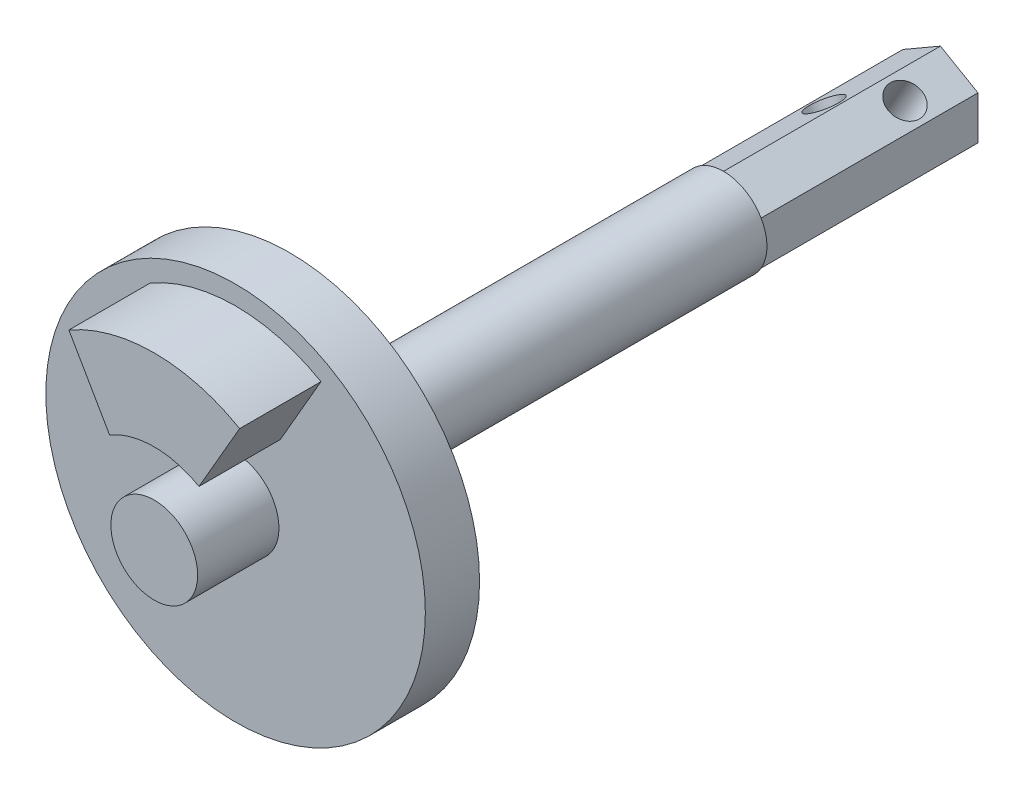
ISO-10303-21;
HEADER;
FILE_DESCRIPTION(('STEP AP214'),'2;1');
FILE_NAME('part.step','',(''),(''),'','','');
FILE_SCHEMA(('AUTOMOTIVE_DESIGN { 1 0 10303 214 1 1 1 1 }'));
ENDSEC;
DATA;
#1=APPLICATION_CONTEXT('core data for automotive mechanical design processes');
#2=APPLICATION_PROTOCOL_DEFINITION('international standard','automotive_design',2000,#1);
#3=PRODUCT_CONTEXT('',#1,'mechanical');
#4=PRODUCT('Part','Part','',(#3));
#5=PRODUCT_RELATED_PRODUCT_CATEGORY('part','',(#4));
#6=PRODUCT_DEFINITION_FORMATION('','',#4);
#7=PRODUCT_DEFINITION_CONTEXT('part definition',#1,'design');
#8=PRODUCT_DEFINITION('design','',#6,#7);
#9=PRODUCT_DEFINITION_SHAPE('','',#8);
#10=(LENGTH_UNIT() NAMED_UNIT(*) SI_UNIT(.MILLI.,.METRE.));
#11=(NAMED_UNIT(*) PLANE_ANGLE_UNIT() SI_UNIT($,.RADIAN.));
#12=(NAMED_UNIT(*) SI_UNIT($,.STERADIAN.) SOLID_ANGLE_UNIT());
#13=UNCERTAINTY_MEASURE_WITH_UNIT(LENGTH_MEASURE(1.E-05),#10,'distance_accuracy_value','');
#14=(GEOMETRIC_REPRESENTATION_CONTEXT(3) GLOBAL_UNCERTAINTY_ASSIGNED_CONTEXT((#13)) GLOBAL_UNIT_ASSIGNED_CONTEXT((#10,
#11,#12)) REPRESENTATION_CONTEXT('',''));
#15=CARTESIAN_POINT('',(0.,0.,0.));
#16=DIRECTION('',(0.,0.,1.));
#17=DIRECTION('',(1.,0.,0.));
#18=AXIS2_PLACEMENT_3D('',#15,#16,#17);
#19=CARTESIAN_POINT('',(0.,0.,-42.5));
#20=DIRECTION('',(0.,0.,-1.));
#21=DIRECTION('',(-1.,0.,0.));
#22=AXIS2_PLACEMENT_3D('',#19,#20,#21);
#23=PLANE('',#22);
#24=DIRECTION('',(0.,-1.,0.));
#25=VECTOR('',#24,1.);
#26=CARTESIAN_POINT('',(3.46410161513776,2.,-42.5));
#27=LINE('',#26,#25);
#28=CARTESIAN_POINT('',(3.46410161513776,2.,-42.5));
#29=VERTEX_POINT('',#28);
#30=CARTESIAN_POINT('',(3.46410161513776,-2.,-42.5));
#31=VERTEX_POINT('',#30);
#32=EDGE_CURVE('E142',#29,#31,#27,.T.);
#33=ORIENTED_EDGE('',*,*,#32,.F.);
#34=CARTESIAN_POINT('',(0.,0.,-42.5));
#35=DIRECTION('',(0.,0.,-1.));
#36=DIRECTION('',(-1.,0.,0.));
#37=AXIS2_PLACEMENT_3D('',#34,#35,#36);
#38=CIRCLE('',#37,4.);
#39=EDGE_CURVE('E288',#29,#31,#38,.T.);
#40=ORIENTED_EDGE('',*,*,#39,.T.);
#41=EDGE_LOOP('',(#33,#40));
#42=FACE_BOUND('',#41,.T.);
#43=ADVANCED_FACE('F39',(#42),#23,.T.);
#44=DIRECTION('',(0.866025403784438,-0.500000000000001,0.));
#45=VECTOR('',#44,1.);
#46=CARTESIAN_POINT('',(0.,4.,-42.5));
#47=LINE('',#46,#45);
#48=CARTESIAN_POINT('',(0.,4.,-42.5));
#49=VERTEX_POINT('',#48);
#50=EDGE_CURVE('E139',#49,#29,#47,.T.);
#51=ORIENTED_EDGE('',*,*,#50,.F.);
#52=EDGE_CURVE('E153',#49,#29,#38,.T.);
#53=ORIENTED_EDGE('',*,*,#52,.T.);
#54=EDGE_LOOP('',(#51,#53));
#55=FACE_BOUND('',#54,.T.);
#56=ADVANCED_FACE('F211',(#55),#23,.T.);
#57=DIRECTION('',(0.866025403784439,0.5,0.));
#58=VECTOR('',#57,1.);
#59=CARTESIAN_POINT('',(-3.46410161513775,2.,-42.5));
#60=LINE('',#59,#58);
#61=CARTESIAN_POINT('',(-3.46410161513775,2.,-42.5));
#62=VERTEX_POINT('',#61);
#63=EDGE_CURVE('E262',#62,#49,#60,.T.);
#64=ORIENTED_EDGE('',*,*,#63,.F.);
#65=EDGE_CURVE('E147',#62,#49,#38,.T.);
#66=ORIENTED_EDGE('',*,*,#65,.T.);
#67=EDGE_LOOP('',(#64,#66));
#68=FACE_BOUND('',#67,.T.);
#69=ADVANCED_FACE('F218',(#68),#23,.T.);
#70=DIRECTION('',(0.,1.,0.));
#71=VECTOR('',#70,1.);
#72=CARTESIAN_POINT('',(-3.46410161513775,-2.,-42.5));
#73=LINE('',#72,#71);
#74=CARTESIAN_POINT('',(-3.46410161513775,-2.,-42.5));
#75=VERTEX_POINT('',#74);
#76=EDGE_CURVE('E55',#75,#62,#73,.T.);
#77=ORIENTED_EDGE('',*,*,#76,.F.);
#78=EDGE_CURVE('E143',#75,#62,#38,.T.);
#79=ORIENTED_EDGE('',*,*,#78,.T.);
#80=EDGE_LOOP('',(#77,#79));
#81=FACE_BOUND('',#80,.T.);
#82=ADVANCED_FACE('F232',(#81),#23,.T.);
#83=DIRECTION('',(-0.866025403784439,0.5,0.));
#84=VECTOR('',#83,1.);
#85=CARTESIAN_POINT('',(0.,-4.,-42.5));
#86=LINE('',#85,#84);
#87=CARTESIAN_POINT('',(0.,-4.,-42.5));
#88=VERTEX_POINT('',#87);
#89=EDGE_CURVE('E242',#88,#75,#86,.T.);
#90=ORIENTED_EDGE('',*,*,#89,.F.);
#91=EDGE_CURVE('E145',#88,#75,#38,.T.);
#92=ORIENTED_EDGE('',*,*,#91,.T.);
#93=EDGE_LOOP('',(#90,#92));
#94=FACE_BOUND('',#93,.T.);
#95=ADVANCED_FACE('F224',(#94),#23,.T.);
#96=CARTESIAN_POINT('',(0.,0.,2.5));
#97=DIRECTION('',(0.,0.,1.));
#98=DIRECTION('',(1.,0.,0.));
#99=AXIS2_PLACEMENT_3D('',#96,#97,#98);
#100=PLANE('',#99);
#101=CARTESIAN_POINT('',(0.,0.,2.5));
#102=DIRECTION('',(0.,0.,1.));
#103=DIRECTION('',(1.,0.,0.));
#104=AXIS2_PLACEMENT_3D('',#101,#102,#103);
#105=CIRCLE('',#104,4.);
#106=CARTESIAN_POINT('',(4.,0.,2.5));
#107=VERTEX_POINT('',#106);
#108=EDGE_CURVE('E152',#107,#107,#105,.T.);
#109=ORIENTED_EDGE('',*,*,#108,.F.);
#110=EDGE_LOOP('',(#109));
#111=FACE_BOUND('',#110,.T.);
#112=CARTESIAN_POINT('',(0.,0.,2.5));
#113=DIRECTION('',(0.,0.,1.));
#114=DIRECTION('',(1.,0.,0.));
#115=AXIS2_PLACEMENT_3D('',#112,#113,#114);
#116=CIRCLE('',#115,17.5);
#117=CARTESIAN_POINT('',(17.5,0.,2.5));
#118=VERTEX_POINT('',#117);
#119=EDGE_CURVE('E48',#118,#118,#116,.T.);
#120=ORIENTED_EDGE('',*,*,#119,.T.);
#121=EDGE_LOOP('',(#120));
#122=FACE_BOUND('',#121,.T.);
#123=DIRECTION('',(0.499999999999996,-0.866025403784441,0.));
#124=VECTOR('',#123,1.);
#125=CARTESIAN_POINT('',(-4.12499999999996,7.14470958122165,2.5));
#126=LINE('',#125,#124);
#127=CARTESIAN_POINT('',(-7.87499999999993,13.639900109605,2.5));
#128=VERTEX_POINT('',#127);
#129=CARTESIAN_POINT('',(-4.12499999999996,7.14470958122165,2.5));
#130=VERTEX_POINT('',#129);
#131=EDGE_CURVE('E174',#128,#130,#126,.T.);
#132=ORIENTED_EDGE('',*,*,#131,.F.);
#133=CARTESIAN_POINT('',(0.,0.,2.5));
#134=DIRECTION('',(0.,0.,1.));
#135=DIRECTION('',(-1.,0.,0.));
#136=AXIS2_PLACEMENT_3D('',#133,#134,#135);
#137=CIRCLE('',#136,15.75);
#138=CARTESIAN_POINT('',(7.87499999999993,13.639900109605,2.5));
#139=VERTEX_POINT('',#138);
#140=EDGE_CURVE('E158',#139,#128,#137,.T.);
#141=ORIENTED_EDGE('',*,*,#140,.F.);
#142=DIRECTION('',(0.499999999999995,0.866025403784441,0.));
#143=VECTOR('',#142,1.);
#144=CARTESIAN_POINT('',(7.87499999999993,13.639900109605,2.5));
#145=LINE('',#144,#143);
#146=CARTESIAN_POINT('',(4.12499999999996,7.14470958122164,2.5));
#147=VERTEX_POINT('',#146);
#148=EDGE_CURVE('E165',#147,#139,#145,.T.);
#149=ORIENTED_EDGE('',*,*,#148,.F.);
#150=CARTESIAN_POINT('',(0.,0.,2.5));
#151=DIRECTION('',(0.,0.,-1.));
#152=DIRECTION('',(1.,0.,0.));
#153=AXIS2_PLACEMENT_3D('',#150,#151,#152);
#154=CIRCLE('',#153,8.25);
#155=EDGE_CURVE('E176',#130,#147,#154,.T.);
#156=ORIENTED_EDGE('',*,*,#155,.F.);
#157=EDGE_LOOP('',(#132,#141,#149,#156));
#158=FACE_BOUND('',#157,.T.);
#159=ADVANCED_FACE('F206',(#111,#122,#158),#100,.T.);
#160=CARTESIAN_POINT('',(0.,0.,2.5));
#161=DIRECTION('',(0.,0.,-1.));
#162=DIRECTION('',(-1.,0.,0.));
#163=AXIS2_PLACEMENT_3D('',#160,#161,#162);
#164=CYLINDRICAL_SURFACE('',#163,17.5);
#165=ORIENTED_EDGE('',*,*,#119,.F.);
#166=EDGE_LOOP('',(#165));
#167=FACE_BOUND('',#166,.T.);
#168=CARTESIAN_POINT('',(0.,0.,-2.5));
#169=DIRECTION('',(0.,0.,1.));
#170=DIRECTION('',(1.,0.,0.));
#171=AXIS2_PLACEMENT_3D('',#168,#169,#170);
#172=CIRCLE('',#171,17.5);
#173=CARTESIAN_POINT('',(17.5,0.,-2.5));
#174=VERTEX_POINT('',#173);
#175=EDGE_CURVE('E43',#174,#174,#172,.T.);
#176=ORIENTED_EDGE('',*,*,#175,.T.);
#177=EDGE_LOOP('',(#176));
#178=FACE_BOUND('',#177,.T.);
#179=ADVANCED_FACE('F41',(#167,#178),#164,.T.);
#180=CARTESIAN_POINT('',(0.,0.,-2.5));
#181=DIRECTION('',(0.,0.,1.));
#182=DIRECTION('',(1.,0.,0.));
#183=AXIS2_PLACEMENT_3D('',#180,#181,#182);
#184=PLANE('',#183);
#185=CARTESIAN_POINT('',(0.,0.,-2.5));
#186=DIRECTION('',(0.,0.,-1.));
#187=DIRECTION('',(-1.,0.,0.));
#188=AXIS2_PLACEMENT_3D('',#185,#186,#187);
#189=CIRCLE('',#188,4.);
#190=CARTESIAN_POINT('',(-4.,0.,-2.5));
#191=VERTEX_POINT('',#190);
#192=EDGE_CURVE('E11',#191,#191,#189,.T.);
#193=ORIENTED_EDGE('',*,*,#192,.F.);
#194=EDGE_LOOP('',(#193));
#195=FACE_BOUND('',#194,.T.);
#196=ORIENTED_EDGE('',*,*,#175,.F.);
#197=EDGE_LOOP('',(#196));
#198=FACE_BOUND('',#197,.T.);
#199=ADVANCED_FACE('F195',(#195,#198),#184,.F.);
#200=CARTESIAN_POINT('',(0.,0.,10.));
#201=DIRECTION('',(0.,0.,-1.));
#202=DIRECTION('',(-1.,0.,0.));
#203=AXIS2_PLACEMENT_3D('',#200,#201,#202);
#204=CYLINDRICAL_SURFACE('',#203,15.75);
#205=ORIENTED_EDGE('',*,*,#140,.T.);
#206=DIRECTION('',(0.,0.,-1.));
#207=VECTOR('',#206,1.);
#208=CARTESIAN_POINT('',(-7.87499999999993,13.639900109605,10.));
#209=LINE('',#208,#207);
#210=CARTESIAN_POINT('',(-7.87499999999993,13.639900109605,10.));
#211=VERTEX_POINT('',#210);
#212=EDGE_CURVE('E187',#211,#128,#209,.T.);
#213=ORIENTED_EDGE('',*,*,#212,.F.);
#214=CARTESIAN_POINT('',(0.,0.,10.));
#215=DIRECTION('',(0.,0.,1.));
#216=DIRECTION('',(-1.,0.,0.));
#217=AXIS2_PLACEMENT_3D('',#214,#215,#216);
#218=CIRCLE('',#217,15.75);
#219=CARTESIAN_POINT('',(7.87499999999993,13.639900109605,10.));
#220=VERTEX_POINT('',#219);
#221=EDGE_CURVE('E161',#220,#211,#218,.T.);
#222=ORIENTED_EDGE('',*,*,#221,.F.);
#223=DIRECTION('',(0.,0.,-1.));
#224=VECTOR('',#223,1.);
#225=CARTESIAN_POINT('',(7.87499999999993,13.639900109605,10.));
#226=LINE('',#225,#224);
#227=EDGE_CURVE('E171',#220,#139,#226,.T.);
#228=ORIENTED_EDGE('',*,*,#227,.T.);
#229=EDGE_LOOP('',(#205,#213,#222,#228));
#230=FACE_BOUND('',#229,.T.);
#231=ADVANCED_FACE('F197',(#230),#204,.T.);
#232=CARTESIAN_POINT('',(-4.12499999999996,7.14470958122165,10.));
#233=DIRECTION('',(0.866025403784441,0.499999999999996,0.));
#234=DIRECTION('',(-0.499999999999996,0.866025403784441,0.));
#235=AXIS2_PLACEMENT_3D('',#232,#233,#234);
#236=PLANE('',#235);
#237=ORIENTED_EDGE('',*,*,#131,.T.);
#238=DIRECTION('',(0.,0.,-1.));
#239=VECTOR('',#238,1.);
#240=CARTESIAN_POINT('',(-4.12499999999996,7.14470958122165,10.));
#241=LINE('',#240,#239);
#242=CARTESIAN_POINT('',(-4.12499999999996,7.14470958122165,10.));
#243=VERTEX_POINT('',#242);
#244=EDGE_CURVE('E184',#243,#130,#241,.T.);
#245=ORIENTED_EDGE('',*,*,#244,.F.);
#246=DIRECTION('',(0.499999999999996,-0.866025403784441,0.));
#247=VECTOR('',#246,1.);
#248=CARTESIAN_POINT('',(-4.12499999999996,7.14470958122165,10.));
#249=LINE('',#248,#247);
#250=EDGE_CURVE('E164',#211,#243,#249,.T.);
#251=ORIENTED_EDGE('',*,*,#250,.F.);
#252=ORIENTED_EDGE('',*,*,#212,.T.);
#253=EDGE_LOOP('',(#237,#245,#251,#252));
#254=FACE_BOUND('',#253,.T.);
#255=ADVANCED_FACE('F203',(#254),#236,.F.);
#256=CARTESIAN_POINT('',(0.,0.,10.));
#257=DIRECTION('',(0.,0.,-1.));
#258=DIRECTION('',(-1.,0.,0.));
#259=AXIS2_PLACEMENT_3D('',#256,#257,#258);
#260=CYLINDRICAL_SURFACE('',#259,8.25);
#261=ORIENTED_EDGE('',*,*,#155,.T.);
#262=DIRECTION('',(0.,0.,-1.));
#263=VECTOR('',#262,1.);
#264=CARTESIAN_POINT('',(4.12499999999996,7.14470958122164,10.));
#265=LINE('',#264,#263);
#266=CARTESIAN_POINT('',(4.12499999999996,7.14470958122164,10.));
#267=VERTEX_POINT('',#266);
#268=EDGE_CURVE('E182',#267,#147,#265,.T.);
#269=ORIENTED_EDGE('',*,*,#268,.F.);
#270=CARTESIAN_POINT('',(0.,0.,10.));
#271=DIRECTION('',(0.,0.,-1.));
#272=DIRECTION('',(1.,0.,0.));
#273=AXIS2_PLACEMENT_3D('',#270,#271,#272);
#274=CIRCLE('',#273,8.25);
#275=EDGE_CURVE('E167',#243,#267,#274,.T.);
#276=ORIENTED_EDGE('',*,*,#275,.F.);
#277=ORIENTED_EDGE('',*,*,#244,.T.);
#278=EDGE_LOOP('',(#261,#269,#276,#277));
#279=FACE_BOUND('',#278,.T.);
#280=ADVANCED_FACE('F470',(#279),#260,.F.);
#281=CARTESIAN_POINT('',(7.87499999999993,13.639900109605,10.));
#282=DIRECTION('',(-0.866025403784441,0.499999999999995,0.));
#283=DIRECTION('',(-0.499999999999995,-0.866025403784441,0.));
#284=AXIS2_PLACEMENT_3D('',#281,#282,#283);
#285=PLANE('',#284);
#286=ORIENTED_EDGE('',*,*,#148,.T.);
#287=ORIENTED_EDGE('',*,*,#227,.F.);
#288=DIRECTION('',(0.499999999999995,0.866025403784441,0.));
#289=VECTOR('',#288,1.);
#290=CARTESIAN_POINT('',(7.87499999999993,13.639900109605,10.));
#291=LINE('',#290,#289);
#292=EDGE_CURVE('E169',#267,#220,#291,.T.);
#293=ORIENTED_EDGE('',*,*,#292,.F.);
#294=ORIENTED_EDGE('',*,*,#268,.T.);
#295=EDGE_LOOP('',(#286,#287,#293,#294));
#296=FACE_BOUND('',#295,.T.);
#297=ADVANCED_FACE('F460',(#296),#285,.F.);
#298=CARTESIAN_POINT('',(0.,0.,10.));
#299=DIRECTION('',(0.,0.,-1.));
#300=DIRECTION('',(-1.,0.,0.));
#301=AXIS2_PLACEMENT_3D('',#298,#299,#300);
#302=PLANE('',#301);
#303=ORIENTED_EDGE('',*,*,#221,.T.);
#304=ORIENTED_EDGE('',*,*,#250,.T.);
#305=ORIENTED_EDGE('',*,*,#275,.T.);
#306=ORIENTED_EDGE('',*,*,#292,.T.);
#307=EDGE_LOOP('',(#303,#304,#305,#306));
#308=FACE_BOUND('',#307,.T.);
#309=ADVANCED_FACE('F444',(#308),#302,.F.);
#310=CARTESIAN_POINT('',(0.,0.,10.));
#311=DIRECTION('',(0.,0.,-1.));
#312=DIRECTION('',(-1.,0.,0.));
#313=AXIS2_PLACEMENT_3D('',#310,#311,#312);
#314=CYLINDRICAL_SURFACE('',#313,4.);
#315=CARTESIAN_POINT('',(0.,0.,10.));
#316=DIRECTION('',(0.,0.,1.));
#317=DIRECTION('',(1.,0.,0.));
#318=AXIS2_PLACEMENT_3D('',#315,#316,#317);
#319=CIRCLE('',#318,4.);
#320=CARTESIAN_POINT('',(4.,0.,10.));
#321=VERTEX_POINT('',#320);
#322=EDGE_CURVE('E155',#321,#321,#319,.T.);
#323=ORIENTED_EDGE('',*,*,#322,.F.);
#324=EDGE_LOOP('',(#323));
#325=FACE_BOUND('',#324,.T.);
#326=ORIENTED_EDGE('',*,*,#108,.T.);
#327=EDGE_LOOP('',(#326));
#328=FACE_BOUND('',#327,.T.);
#329=ADVANCED_FACE('F434',(#325,#328),#314,.T.);
#330=CARTESIAN_POINT('',(0.,0.,10.));
#331=DIRECTION('',(0.,0.,1.));
#332=DIRECTION('',(1.,0.,0.));
#333=AXIS2_PLACEMENT_3D('',#330,#331,#332);
#334=PLANE('',#333);
#335=ORIENTED_EDGE('',*,*,#322,.T.);
#336=EDGE_LOOP('',(#335));
#337=FACE_BOUND('',#336,.T.);
#338=ADVANCED_FACE('F229',(#337),#334,.T.);
#339=CARTESIAN_POINT('',(0.,0.,-42.5));
#340=DIRECTION('',(0.,0.,1.));
#341=DIRECTION('',(1.,0.,0.));
#342=AXIS2_PLACEMENT_3D('',#339,#340,#341);
#343=CYLINDRICAL_SURFACE('',#342,4.);
#344=ORIENTED_EDGE('',*,*,#65,.F.);
#345=ORIENTED_EDGE('',*,*,#78,.F.);
#346=ORIENTED_EDGE('',*,*,#91,.F.);
#347=EDGE_CURVE('E290',#31,#88,#38,.T.);
#348=ORIENTED_EDGE('',*,*,#347,.F.);
#349=ORIENTED_EDGE('',*,*,#39,.F.);
#350=ORIENTED_EDGE('',*,*,#52,.F.);
#351=EDGE_LOOP('',(#344,#345,#346,#348,#349,#350));
#352=FACE_BOUND('',#351,.T.);
#353=ORIENTED_EDGE('',*,*,#192,.T.);
#354=EDGE_LOOP('',(#353));
#355=FACE_BOUND('',#354,.T.);
#356=ADVANCED_FACE('F223',(#352,#355),#343,.T.);
#357=DIRECTION('',(-0.866025403784439,-0.5,0.));
#358=VECTOR('',#357,1.);
#359=CARTESIAN_POINT('',(3.46410161513775,-2.,-42.5));
#360=LINE('',#359,#358);
#361=EDGE_CURVE('E62',#31,#88,#360,.T.);
#362=ORIENTED_EDGE('',*,*,#361,.F.);
#363=ORIENTED_EDGE('',*,*,#347,.T.);
#364=EDGE_LOOP('',(#362,#363));
#365=FACE_BOUND('',#364,.T.);
#366=ADVANCED_FACE('F214',(#365),#23,.T.);
#367=CARTESIAN_POINT('',(3.46410161513776,2.,-62.5));
#368=DIRECTION('',(-1.,0.,0.));
#369=DIRECTION('',(0.,-1.,0.));
#370=AXIS2_PLACEMENT_3D('',#367,#368,#369);
#371=PLANE('',#370);
#372=ORIENTED_EDGE('',*,*,#32,.T.);
#373=DIRECTION('',(0.,0.,1.));
#374=VECTOR('',#373,1.);
#375=CARTESIAN_POINT('',(3.46410161513775,-2.,-62.5));
#376=LINE('',#375,#374);
#377=CARTESIAN_POINT('',(3.46410161513775,-2.,-62.5));
#378=VERTEX_POINT('',#377);
#379=EDGE_CURVE('E123',#378,#31,#376,.T.);
#380=ORIENTED_EDGE('',*,*,#379,.F.);
#381=DIRECTION('',(0.,-1.,0.));
#382=VECTOR('',#381,1.);
#383=CARTESIAN_POINT('',(3.46410161513776,2.,-62.5));
#384=LINE('',#383,#382);
#385=CARTESIAN_POINT('',(3.46410161513776,2.,-62.5));
#386=VERTEX_POINT('',#385);
#387=EDGE_CURVE('E130',#386,#378,#384,.T.);
#388=ORIENTED_EDGE('',*,*,#387,.F.);
#389=DIRECTION('',(0.,0.,1.));
#390=VECTOR('',#389,1.);
#391=CARTESIAN_POINT('',(3.46410161513776,2.,-62.5));
#392=LINE('',#391,#390);
#393=EDGE_CURVE('E258',#386,#29,#392,.T.);
#394=ORIENTED_EDGE('',*,*,#393,.T.);
#395=EDGE_LOOP('',(#372,#380,#388,#394));
#396=FACE_BOUND('',#395,.T.);
#397=ADVANCED_FACE('F141',(#396),#371,.F.);
#398=CARTESIAN_POINT('',(3.46410161513775,-2.,-62.5));
#399=DIRECTION('',(-0.5,0.866025403784438,0.));
#400=DIRECTION('',(-0.866025403784438,-0.5,0.));
#401=AXIS2_PLACEMENT_3D('',#398,#399,#400);
#402=PLANE('',#401);
#403=CARTESIAN_POINT('',(1.73205080756888,-3.,-53.5));
#404=DIRECTION('',(-0.499999999999997,0.86602540378444,0.));
#405=DIRECTION('',(-0.86602540378444,-0.499999999999997,0.));
#406=AXIS2_PLACEMENT_3D('',#403,#404,#405);
#407=CIRCLE('',#406,1.55);
#408=CARTESIAN_POINT('',(0.389711431702995,-3.77499999999999,-53.5));
#409=VERTEX_POINT('',#408);
#410=EDGE_CURVE('E405',#409,#409,#407,.T.);
#411=ORIENTED_EDGE('',*,*,#410,.T.);
#412=EDGE_LOOP('',(#411));
#413=FACE_BOUND('',#412,.T.);
#414=ORIENTED_EDGE('',*,*,#361,.T.);
#415=DIRECTION('',(0.,0.,1.));
#416=VECTOR('',#415,1.);
#417=CARTESIAN_POINT('',(0.,-4.,-62.5));
#418=LINE('',#417,#416);
#419=CARTESIAN_POINT('',(0.,-4.,-62.5));
#420=VERTEX_POINT('',#419);
#421=EDGE_CURVE('E126',#420,#88,#418,.T.);
#422=ORIENTED_EDGE('',*,*,#421,.F.);
#423=DIRECTION('',(-0.866025403784439,-0.5,0.));
#424=VECTOR('',#423,1.);
#425=CARTESIAN_POINT('',(3.46410161513775,-2.,-62.5));
#426=LINE('',#425,#424);
#427=EDGE_CURVE('E119',#378,#420,#426,.T.);
#428=ORIENTED_EDGE('',*,*,#427,.F.);
#429=ORIENTED_EDGE('',*,*,#379,.T.);
#430=EDGE_LOOP('',(#414,#422,#428,#429));
#431=FACE_BOUND('',#430,.T.);
#432=ADVANCED_FACE('F121',(#413,#431),#402,.F.);
#433=CARTESIAN_POINT('',(0.,-4.,-62.5));
#434=DIRECTION('',(0.5,0.866025403784439,0.));
#435=DIRECTION('',(-0.866025403784439,0.5,0.));
#436=AXIS2_PLACEMENT_3D('',#433,#434,#435);
#437=PLANE('',#436);
#438=CARTESIAN_POINT('',(-1.73205080756888,-3.,-57.5));
#439=DIRECTION('',(-0.500000000000006,-0.866025403784435,0.));
#440=DIRECTION('',(0.866025403784435,-0.500000000000006,0.));
#441=AXIS2_PLACEMENT_3D('',#438,#439,#440);
#442=CIRCLE('',#441,1.55000000000003);
#443=CARTESIAN_POINT('',(-0.389711431702974,-3.77500000000003,-57.5));
#444=VERTEX_POINT('',#443);
#445=EDGE_CURVE('E407',#444,#444,#442,.T.);
#446=ORIENTED_EDGE('',*,*,#445,.F.);
#447=EDGE_LOOP('',(#446));
#448=FACE_BOUND('',#447,.T.);
#449=ORIENTED_EDGE('',*,*,#89,.T.);
#450=DIRECTION('',(0.,0.,1.));
#451=VECTOR('',#450,1.);
#452=CARTESIAN_POINT('',(-3.46410161513775,-2.,-62.5));
#453=LINE('',#452,#451);
#454=CARTESIAN_POINT('',(-3.46410161513775,-2.,-62.5));
#455=VERTEX_POINT('',#454);
#456=EDGE_CURVE('E148',#455,#75,#453,.T.);
#457=ORIENTED_EDGE('',*,*,#456,.F.);
#458=DIRECTION('',(-0.866025403784439,0.5,0.));
#459=VECTOR('',#458,1.);
#460=CARTESIAN_POINT('',(0.,-4.,-62.5));
#461=LINE('',#460,#459);
#462=EDGE_CURVE('E129',#420,#455,#461,.T.);
#463=ORIENTED_EDGE('',*,*,#462,.F.);
#464=ORIENTED_EDGE('',*,*,#421,.T.);
#465=EDGE_LOOP('',(#449,#457,#463,#464));
#466=FACE_BOUND('',#465,.T.);
#467=ADVANCED_FACE('F249',(#448,#466),#437,.F.);
#468=CARTESIAN_POINT('',(-3.46410161513775,-2.,-62.5));
#469=DIRECTION('',(1.,0.,0.));
#470=DIRECTION('',(0.,1.,0.));
#471=AXIS2_PLACEMENT_3D('',#468,#469,#470);
#472=PLANE('',#471);
#473=ORIENTED_EDGE('',*,*,#76,.T.);
#474=DIRECTION('',(0.,0.,1.));
#475=VECTOR('',#474,1.);
#476=CARTESIAN_POINT('',(-3.46410161513775,2.,-62.5));
#477=LINE('',#476,#475);
#478=CARTESIAN_POINT('',(-3.46410161513775,2.,-62.5));
#479=VERTEX_POINT('',#478);
#480=EDGE_CURVE('E271',#479,#62,#477,.T.);
#481=ORIENTED_EDGE('',*,*,#480,.F.);
#482=DIRECTION('',(0.,1.,0.));
#483=VECTOR('',#482,1.);
#484=CARTESIAN_POINT('',(-3.46410161513775,-2.,-62.5));
#485=LINE('',#484,#483);
#486=EDGE_CURVE('E251',#455,#479,#485,.T.);
#487=ORIENTED_EDGE('',*,*,#486,.F.);
#488=ORIENTED_EDGE('',*,*,#456,.T.);
#489=EDGE_LOOP('',(#473,#481,#487,#488));
#490=FACE_BOUND('',#489,.T.);
#491=ADVANCED_FACE('F274',(#490),#472,.F.);
#492=CARTESIAN_POINT('',(-3.46410161513775,2.,-62.5));
#493=DIRECTION('',(0.5,-0.866025403784439,0.));
#494=DIRECTION('',(0.866025403784439,0.5,0.));
#495=AXIS2_PLACEMENT_3D('',#492,#493,#494);
#496=PLANE('',#495);
#497=CARTESIAN_POINT('',(-1.73205080756886,3.00000000000001,-53.5));
#498=DIRECTION('',(0.5,-0.866025403784439,0.));
#499=DIRECTION('',(0.866025403784439,0.5,0.));
#500=AXIS2_PLACEMENT_3D('',#497,#498,#499);
#501=CIRCLE('',#500,1.55);
#502=CARTESIAN_POINT('',(-0.389711431702974,3.77500000000001,-53.5));
#503=VERTEX_POINT('',#502);
#504=EDGE_CURVE('E402',#503,#503,#501,.T.);
#505=ORIENTED_EDGE('',*,*,#504,.T.);
#506=EDGE_LOOP('',(#505));
#507=FACE_BOUND('',#506,.T.);
#508=ORIENTED_EDGE('',*,*,#63,.T.);
#509=DIRECTION('',(0.,0.,1.));
#510=VECTOR('',#509,1.);
#511=CARTESIAN_POINT('',(0.,4.,-62.5));
#512=LINE('',#511,#510);
#513=CARTESIAN_POINT('',(0.,4.,-62.5));
#514=VERTEX_POINT('',#513);
#515=EDGE_CURVE('E268',#514,#49,#512,.T.);
#516=ORIENTED_EDGE('',*,*,#515,.F.);
#517=DIRECTION('',(0.866025403784439,0.5,0.));
#518=VECTOR('',#517,1.);
#519=CARTESIAN_POINT('',(-3.46410161513775,2.,-62.5));
#520=LINE('',#519,#518);
#521=EDGE_CURVE('E253',#479,#514,#520,.T.);
#522=ORIENTED_EDGE('',*,*,#521,.F.);
#523=ORIENTED_EDGE('',*,*,#480,.T.);
#524=EDGE_LOOP('',(#508,#516,#522,#523));
#525=FACE_BOUND('',#524,.T.);
#526=ADVANCED_FACE('F279',(#507,#525),#496,.F.);
#527=CARTESIAN_POINT('',(0.,4.,-62.5));
#528=DIRECTION('',(-0.500000000000001,-0.866025403784438,0.));
#529=DIRECTION('',(0.866025403784438,-0.500000000000001,0.));
#530=AXIS2_PLACEMENT_3D('',#527,#528,#529);
#531=PLANE('',#530);
#532=CARTESIAN_POINT('',(1.73205080756892,2.99999999999998,-57.5));
#533=DIRECTION('',(-0.500000000000001,-0.866025403784438,0.));
#534=DIRECTION('',(0.866025403784438,-0.500000000000001,0.));
#535=AXIS2_PLACEMENT_3D('',#532,#533,#534);
#536=CIRCLE('',#535,1.55000000000003);
#537=CARTESIAN_POINT('',(3.07439018343483,2.22499999999996,-57.5));
#538=VERTEX_POINT('',#537);
#539=EDGE_CURVE('E259',#538,#538,#536,.F.);
#540=ORIENTED_EDGE('',*,*,#539,.F.);
#541=EDGE_LOOP('',(#540));
#542=FACE_BOUND('',#541,.T.);
#543=ORIENTED_EDGE('',*,*,#50,.T.);
#544=ORIENTED_EDGE('',*,*,#393,.F.);
#545=DIRECTION('',(0.866025403784438,-0.500000000000001,0.));
#546=VECTOR('',#545,1.);
#547=CARTESIAN_POINT('',(0.,4.,-62.5));
#548=LINE('',#547,#546);
#549=EDGE_CURVE('E135',#514,#386,#548,.T.);
#550=ORIENTED_EDGE('',*,*,#549,.F.);
#551=ORIENTED_EDGE('',*,*,#515,.T.);
#552=EDGE_LOOP('',(#543,#544,#550,#551));
#553=FACE_BOUND('',#552,.T.);
#554=ADVANCED_FACE('F281',(#542,#553),#531,.F.);
#555=CARTESIAN_POINT('',(0.,0.,-62.5));
#556=DIRECTION('',(0.,0.,-1.));
#557=DIRECTION('',(-1.,0.,0.));
#558=AXIS2_PLACEMENT_3D('',#555,#556,#557);
#559=PLANE('',#558);
#560=ORIENTED_EDGE('',*,*,#387,.T.);
#561=ORIENTED_EDGE('',*,*,#427,.T.);
#562=ORIENTED_EDGE('',*,*,#462,.T.);
#563=ORIENTED_EDGE('',*,*,#486,.T.);
#564=ORIENTED_EDGE('',*,*,#521,.T.);
#565=ORIENTED_EDGE('',*,*,#549,.T.);
#566=EDGE_LOOP('',(#560,#561,#562,#563,#564,#565));
#567=FACE_BOUND('',#566,.T.);
#568=ADVANCED_FACE('F133',(#567),#559,.T.);
#569=CARTESIAN_POINT('',(3.92408182924729,6.79670910131397,-57.5));
#570=DIRECTION('',(-0.500000000000006,-0.866025403784435,0.));
#571=DIRECTION('',(0.866025403784435,-0.500000000000006,0.));
#572=AXIS2_PLACEMENT_3D('',#569,#570,#571);
#573=CYLINDRICAL_SURFACE('',#572,1.55000000000003);
#574=ORIENTED_EDGE('',*,*,#539,.T.);
#575=EDGE_LOOP('',(#574));
#576=FACE_BOUND('',#575,.T.);
#577=ORIENTED_EDGE('',*,*,#445,.T.);
#578=EDGE_LOOP('',(#577));
#579=FACE_BOUND('',#578,.T.);
#580=ADVANCED_FACE('F346',(#576,#579),#573,.F.);
#581=CARTESIAN_POINT('',(-3.92408182924714,6.79670910131395,-53.5));
#582=DIRECTION('',(0.499999999999997,-0.86602540378444,0.));
#583=DIRECTION('',(0.86602540378444,0.499999999999997,0.));
#584=AXIS2_PLACEMENT_3D('',#581,#582,#583);
#585=CYLINDRICAL_SURFACE('',#584,1.55);
#586=ORIENTED_EDGE('',*,*,#504,.F.);
#587=EDGE_LOOP('',(#586));
#588=FACE_BOUND('',#587,.T.);
#589=ORIENTED_EDGE('',*,*,#410,.F.);
#590=EDGE_LOOP('',(#589));
#591=FACE_BOUND('',#590,.T.);
#592=ADVANCED_FACE('F371',(#588,#591),#585,.F.);
#593=CLOSED_SHELL('',(#43,#56,#69,#82,#95,#159,#179,#199,#231,#255,#280,#297,#309,#329,#338,
#356,#366,#397,#432,#467,#491,#526,#554,#568,#580,#592));
#594=MANIFOLD_SOLID_BREP('B2',#593);
#595=ADVANCED_BREP_SHAPE_REPRESENTATION('',(#18,#594),#14);
#596=SHAPE_DEFINITION_REPRESENTATION(#9,#595);
ENDSEC;
END-ISO-10303-21;
